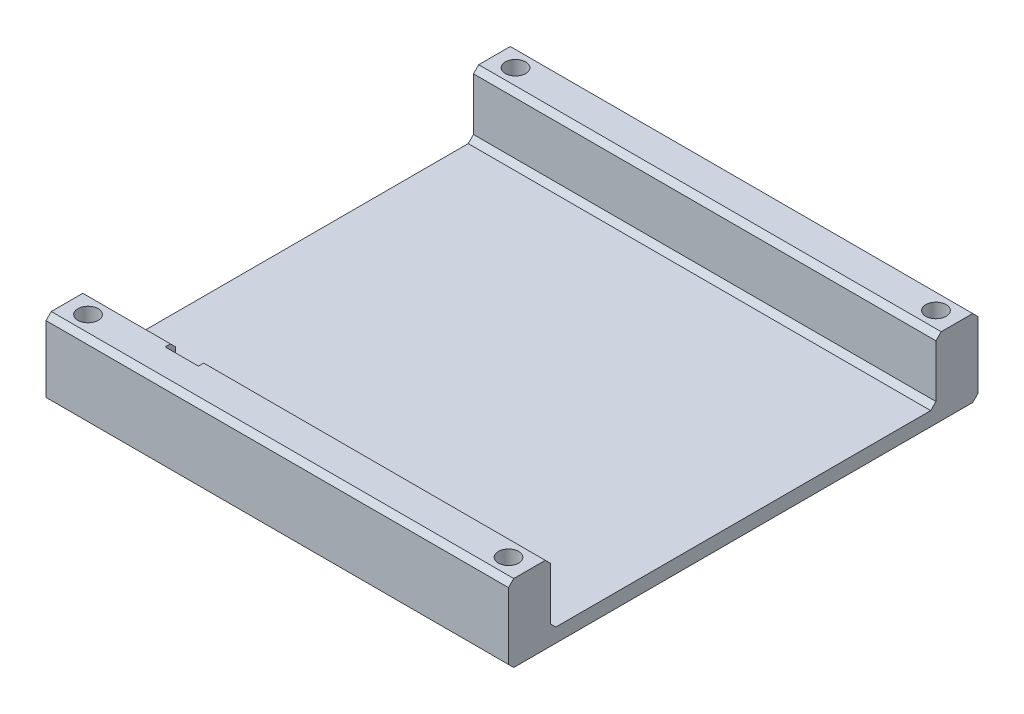
ISO-10303-21;
HEADER;
FILE_DESCRIPTION(('STEP AP214'),'2;1');
FILE_NAME('part.step','',(''),(''),'','','');
FILE_SCHEMA(('AUTOMOTIVE_DESIGN { 1 0 10303 214 1 1 1 1 }'));
ENDSEC;
DATA;
#1=APPLICATION_CONTEXT('core data for automotive mechanical design processes');
#2=APPLICATION_PROTOCOL_DEFINITION('international standard','automotive_design',2000,#1);
#3=PRODUCT_CONTEXT('',#1,'mechanical');
#4=PRODUCT('Part','Part','',(#3));
#5=PRODUCT_RELATED_PRODUCT_CATEGORY('part','',(#4));
#6=PRODUCT_DEFINITION_FORMATION('','',#4);
#7=PRODUCT_DEFINITION_CONTEXT('part definition',#1,'design');
#8=PRODUCT_DEFINITION('design','',#6,#7);
#9=PRODUCT_DEFINITION_SHAPE('','',#8);
#10=(LENGTH_UNIT() NAMED_UNIT(*) SI_UNIT(.MILLI.,.METRE.));
#11=(NAMED_UNIT(*) PLANE_ANGLE_UNIT() SI_UNIT($,.RADIAN.));
#12=(NAMED_UNIT(*) SI_UNIT($,.STERADIAN.) SOLID_ANGLE_UNIT());
#13=UNCERTAINTY_MEASURE_WITH_UNIT(LENGTH_MEASURE(1.E-05),#10,'distance_accuracy_value','');
#14=(GEOMETRIC_REPRESENTATION_CONTEXT(3) GLOBAL_UNCERTAINTY_ASSIGNED_CONTEXT((#13)) GLOBAL_UNIT_ASSIGNED_CONTEXT((#10,
#11,#12)) REPRESENTATION_CONTEXT('',''));
#15=CARTESIAN_POINT('',(0.,0.,0.));
#16=DIRECTION('',(0.,0.,1.));
#17=DIRECTION('',(1.,0.,0.));
#18=AXIS2_PLACEMENT_3D('',#15,#16,#17);
#19=CARTESIAN_POINT('',(0.,2.,0.));
#20=DIRECTION('',(0.,-1.,0.));
#21=DIRECTION('',(0.,0.,-1.));
#22=AXIS2_PLACEMENT_3D('',#19,#20,#21);
#23=PLANE('',#22);
#24=DIRECTION('',(0.,0.,1.));
#25=VECTOR('',#24,1.);
#26=CARTESIAN_POINT('',(17.257397728864,2.,-6.));
#27=LINE('',#26,#25);
#28=CARTESIAN_POINT('',(17.2573977288641,2.,-6.75));
#29=VERTEX_POINT('',#28);
#30=CARTESIAN_POINT('',(17.257397728864,2.,-4.5));
#31=VERTEX_POINT('',#30);
#32=EDGE_CURVE('E227',#29,#31,#27,.T.);
#33=ORIENTED_EDGE('',*,*,#32,.F.);
#34=DIRECTION('',(1.,0.,0.));
#35=VECTOR('',#34,1.);
#36=CARTESIAN_POINT('',(66.,2.,-6.75));
#37=LINE('',#36,#35);
#38=CARTESIAN_POINT('',(66.,2.,-6.75));
#39=VERTEX_POINT('',#38);
#40=EDGE_CURVE('E347',#29,#39,#37,.T.);
#41=ORIENTED_EDGE('',*,*,#40,.T.);
#42=DIRECTION('',(0.,0.,-1.));
#43=VECTOR('',#42,1.);
#44=CARTESIAN_POINT('',(66.,2.,0.));
#45=LINE('',#44,#43);
#46=CARTESIAN_POINT('',(66.,2.,-60.25));
#47=VERTEX_POINT('',#46);
#48=EDGE_CURVE('E250',#39,#47,#45,.T.);
#49=ORIENTED_EDGE('',*,*,#48,.T.);
#50=DIRECTION('',(-1.,0.,0.));
#51=VECTOR('',#50,1.);
#52=CARTESIAN_POINT('',(0.,2.,-60.25));
#53=LINE('',#52,#51);
#54=CARTESIAN_POINT('',(0.,2.,-60.25));
#55=VERTEX_POINT('',#54);
#56=EDGE_CURVE('E337',#47,#55,#53,.T.);
#57=ORIENTED_EDGE('',*,*,#56,.T.);
#58=DIRECTION('',(0.,0.,1.));
#59=VECTOR('',#58,1.);
#60=CARTESIAN_POINT('',(0.,2.,0.));
#61=LINE('',#60,#59);
#62=CARTESIAN_POINT('',(0.,2.,-6.75));
#63=VERTEX_POINT('',#62);
#64=EDGE_CURVE('E241',#55,#63,#61,.T.);
#65=ORIENTED_EDGE('',*,*,#64,.T.);
#66=DIRECTION('',(1.,0.,0.));
#67=VECTOR('',#66,1.);
#68=CARTESIAN_POINT('',(12.5,2.,-6.75));
#69=LINE('',#68,#67);
#70=CARTESIAN_POINT('',(12.5,2.,-6.75));
#71=VERTEX_POINT('',#70);
#72=EDGE_CURVE('E345',#63,#71,#69,.T.);
#73=ORIENTED_EDGE('',*,*,#72,.T.);
#74=DIRECTION('',(0.,0.,-1.));
#75=VECTOR('',#74,1.);
#76=CARTESIAN_POINT('',(12.5,2.,-6.));
#77=LINE('',#76,#75);
#78=CARTESIAN_POINT('',(12.5,2.,-4.5));
#79=VERTEX_POINT('',#78);
#80=EDGE_CURVE('E245',#79,#71,#77,.T.);
#81=ORIENTED_EDGE('',*,*,#80,.F.);
#82=DIRECTION('',(-1.,0.,0.));
#83=VECTOR('',#82,1.);
#84=CARTESIAN_POINT('',(12.5,2.,-4.5));
#85=LINE('',#84,#83);
#86=EDGE_CURVE('E216',#31,#79,#85,.T.);
#87=ORIENTED_EDGE('',*,*,#86,.F.);
#88=EDGE_LOOP('',(#33,#41,#49,#57,#65,#73,#81,#87));
#89=FACE_BOUND('',#88,.T.);
#90=ADVANCED_FACE('F50',(#89),#23,.F.);
#91=CARTESIAN_POINT('',(0.,2.,0.));
#92=DIRECTION('',(1.,0.,0.));
#93=DIRECTION('',(0.,0.,-1.));
#94=AXIS2_PLACEMENT_3D('',#91,#92,#93);
#95=PLANE('',#94);
#96=DIRECTION('',(0.,-1.,0.));
#97=VECTOR('',#96,1.);
#98=CARTESIAN_POINT('',(0.,2.,-67.));
#99=LINE('',#98,#97);
#100=CARTESIAN_POINT('',(0.,10.25,-67.));
#101=VERTEX_POINT('',#100);
#102=CARTESIAN_POINT('',(0.,0.750000000000001,-67.));
#103=VERTEX_POINT('',#102);
#104=EDGE_CURVE('E252',#101,#103,#99,.T.);
#105=ORIENTED_EDGE('',*,*,#104,.T.);
#106=DIRECTION('',(0.,-0.707106781186548,0.707106781186548));
#107=VECTOR('',#106,1.);
#108=CARTESIAN_POINT('',(0.,0.750000000000001,-67.));
#109=LINE('',#108,#107);
#110=CARTESIAN_POINT('',(0.,0.,-66.25));
#111=VERTEX_POINT('',#110);
#112=EDGE_CURVE('E296',#103,#111,#109,.T.);
#113=ORIENTED_EDGE('',*,*,#112,.T.);
#114=DIRECTION('',(0.,0.,1.));
#115=VECTOR('',#114,1.);
#116=CARTESIAN_POINT('',(0.,0.,0.));
#117=LINE('',#116,#115);
#118=CARTESIAN_POINT('',(0.,0.,-0.750000000000001));
#119=VERTEX_POINT('',#118);
#120=EDGE_CURVE('E251',#111,#119,#117,.T.);
#121=ORIENTED_EDGE('',*,*,#120,.T.);
#122=DIRECTION('',(0.,0.707106781186548,0.707106781186548));
#123=VECTOR('',#122,1.);
#124=CARTESIAN_POINT('',(0.,0.750000000000001,0.));
#125=LINE('',#124,#123);
#126=CARTESIAN_POINT('',(0.,0.750000000000001,0.));
#127=VERTEX_POINT('',#126);
#128=EDGE_CURVE('E293',#119,#127,#125,.T.);
#129=ORIENTED_EDGE('',*,*,#128,.T.);
#130=DIRECTION('',(0.,-1.,0.));
#131=VECTOR('',#130,1.);
#132=CARTESIAN_POINT('',(0.,2.,0.));
#133=LINE('',#132,#131);
#134=CARTESIAN_POINT('',(0.,10.25,0.));
#135=VERTEX_POINT('',#134);
#136=EDGE_CURVE('E275',#135,#127,#133,.T.);
#137=ORIENTED_EDGE('',*,*,#136,.F.);
#138=DIRECTION('',(0.,-0.707106781186548,0.707106781186548));
#139=VECTOR('',#138,1.);
#140=CARTESIAN_POINT('',(0.,11.,-0.750000000000001));
#141=LINE('',#140,#139);
#142=CARTESIAN_POINT('',(0.,11.,-0.750000000000001));
#143=VERTEX_POINT('',#142);
#144=EDGE_CURVE('E289',#135,#143,#141,.F.);
#145=ORIENTED_EDGE('',*,*,#144,.T.);
#146=DIRECTION('',(0.,0.,1.));
#147=VECTOR('',#146,1.);
#148=CARTESIAN_POINT('',(0.,11.,0.));
#149=LINE('',#148,#147);
#150=CARTESIAN_POINT('',(0.,11.,-5.24999999999999));
#151=VERTEX_POINT('',#150);
#152=EDGE_CURVE('E236',#151,#143,#149,.T.);
#153=ORIENTED_EDGE('',*,*,#152,.F.);
#154=DIRECTION('',(0.,0.707106781186548,0.707106781186548));
#155=VECTOR('',#154,1.);
#156=CARTESIAN_POINT('',(0.,11.,-5.24999999999999));
#157=LINE('',#156,#155);
#158=CARTESIAN_POINT('',(0.,10.25,-6.));
#159=VERTEX_POINT('',#158);
#160=EDGE_CURVE('E295',#151,#159,#157,.F.);
#161=ORIENTED_EDGE('',*,*,#160,.T.);
#162=DIRECTION('',(0.,-1.,0.));
#163=VECTOR('',#162,1.);
#164=CARTESIAN_POINT('',(0.,11.,-6.));
#165=LINE('',#164,#163);
#166=CARTESIAN_POINT('',(0.,2.75,-6.));
#167=VERTEX_POINT('',#166);
#168=EDGE_CURVE('E224',#159,#167,#165,.T.);
#169=ORIENTED_EDGE('',*,*,#168,.T.);
#170=DIRECTION('',(0.,0.707106781186548,0.707106781186548));
#171=VECTOR('',#170,1.);
#172=CARTESIAN_POINT('',(0.,5.375,-3.375));
#173=LINE('',#172,#171);
#174=EDGE_CURVE('E395',#167,#63,#173,.F.);
#175=ORIENTED_EDGE('',*,*,#174,.T.);
#176=ORIENTED_EDGE('',*,*,#64,.F.);
#177=DIRECTION('',(0.,-0.707106781186548,0.707106781186548));
#178=VECTOR('',#177,1.);
#179=CARTESIAN_POINT('',(0.,-28.125,-30.125));
#180=LINE('',#179,#178);
#181=CARTESIAN_POINT('',(0.,2.75,-61.));
#182=VERTEX_POINT('',#181);
#183=EDGE_CURVE('E11',#55,#182,#180,.F.);
#184=ORIENTED_EDGE('',*,*,#183,.T.);
#185=DIRECTION('',(0.,-1.,0.));
#186=VECTOR('',#185,1.);
#187=CARTESIAN_POINT('',(0.,11.,-61.));
#188=LINE('',#187,#186);
#189=CARTESIAN_POINT('',(0.,10.25,-61.));
#190=VERTEX_POINT('',#189);
#191=EDGE_CURVE('E260',#190,#182,#188,.T.);
#192=ORIENTED_EDGE('',*,*,#191,.F.);
#193=DIRECTION('',(0.,0.707106781186541,-0.707106781186554));
#194=VECTOR('',#193,1.);
#195=CARTESIAN_POINT('',(0.,11.,-61.75));
#196=LINE('',#195,#194);
#197=CARTESIAN_POINT('',(0.,11.,-61.75));
#198=VERTEX_POINT('',#197);
#199=EDGE_CURVE('E281',#190,#198,#196,.T.);
#200=ORIENTED_EDGE('',*,*,#199,.T.);
#201=DIRECTION('',(0.,0.,1.));
#202=VECTOR('',#201,1.);
#203=CARTESIAN_POINT('',(0.,11.,-67.));
#204=LINE('',#203,#202);
#205=CARTESIAN_POINT('',(0.,11.,-66.25));
#206=VERTEX_POINT('',#205);
#207=EDGE_CURVE('E443',#206,#198,#204,.T.);
#208=ORIENTED_EDGE('',*,*,#207,.F.);
#209=DIRECTION('',(0.,-0.707106781186541,-0.707106781186554));
#210=VECTOR('',#209,1.);
#211=CARTESIAN_POINT('',(0.,11.,-66.25));
#212=LINE('',#211,#210);
#213=EDGE_CURVE('E288',#206,#101,#212,.T.);
#214=ORIENTED_EDGE('',*,*,#213,.T.);
#215=EDGE_LOOP('',(#105,#113,#121,#129,#137,#145,#153,#161,#169,#175,#176,#184,#192,#200,#208,#214));
#216=FACE_BOUND('',#215,.T.);
#217=ADVANCED_FACE('F412',(#216),#95,.F.);
#218=CARTESIAN_POINT('',(0.,2.,0.));
#219=DIRECTION('',(0.,0.,-1.));
#220=DIRECTION('',(-1.,0.,0.));
#221=AXIS2_PLACEMENT_3D('',#218,#219,#220);
#222=PLANE('',#221);
#223=ORIENTED_EDGE('',*,*,#136,.T.);
#224=DIRECTION('',(1.,0.,0.));
#225=VECTOR('',#224,1.);
#226=CARTESIAN_POINT('',(66.,0.750000000000001,0.));
#227=LINE('',#226,#225);
#228=CARTESIAN_POINT('',(66.,0.750000000000001,0.));
#229=VERTEX_POINT('',#228);
#230=EDGE_CURVE('E327',#127,#229,#227,.T.);
#231=ORIENTED_EDGE('',*,*,#230,.T.);
#232=DIRECTION('',(0.,-1.,0.));
#233=VECTOR('',#232,1.);
#234=CARTESIAN_POINT('',(66.,2.,0.));
#235=LINE('',#234,#233);
#236=CARTESIAN_POINT('',(66.,10.25,0.));
#237=VERTEX_POINT('',#236);
#238=EDGE_CURVE('E268',#237,#229,#235,.T.);
#239=ORIENTED_EDGE('',*,*,#238,.F.);
#240=DIRECTION('',(-1.,0.,0.));
#241=VECTOR('',#240,1.);
#242=CARTESIAN_POINT('',(0.,10.25,0.));
#243=LINE('',#242,#241);
#244=EDGE_CURVE('E324',#237,#135,#243,.T.);
#245=ORIENTED_EDGE('',*,*,#244,.T.);
#246=EDGE_LOOP('',(#223,#231,#239,#245));
#247=FACE_BOUND('',#246,.T.);
#248=ADVANCED_FACE('F569',(#247),#222,.F.);
#249=CARTESIAN_POINT('',(66.,2.,0.));
#250=DIRECTION('',(-1.,0.,0.));
#251=DIRECTION('',(0.,0.,1.));
#252=AXIS2_PLACEMENT_3D('',#249,#250,#251);
#253=PLANE('',#252);
#254=DIRECTION('',(0.,0.,-1.));
#255=VECTOR('',#254,1.);
#256=CARTESIAN_POINT('',(66.,0.,0.));
#257=LINE('',#256,#255);
#258=CARTESIAN_POINT('',(66.,0.,-0.750000000000001));
#259=VERTEX_POINT('',#258);
#260=CARTESIAN_POINT('',(66.,0.,-66.25));
#261=VERTEX_POINT('',#260);
#262=EDGE_CURVE('E246',#259,#261,#257,.T.);
#263=ORIENTED_EDGE('',*,*,#262,.T.);
#264=DIRECTION('',(0.,0.707106781186548,-0.707106781186548));
#265=VECTOR('',#264,1.);
#266=CARTESIAN_POINT('',(66.,0.750000000000001,-67.));
#267=LINE('',#266,#265);
#268=CARTESIAN_POINT('',(66.,0.750000000000001,-67.));
#269=VERTEX_POINT('',#268);
#270=EDGE_CURVE('E325',#261,#269,#267,.T.);
#271=ORIENTED_EDGE('',*,*,#270,.T.);
#272=DIRECTION('',(0.,-1.,0.));
#273=VECTOR('',#272,1.);
#274=CARTESIAN_POINT('',(66.,2.,-67.));
#275=LINE('',#274,#273);
#276=CARTESIAN_POINT('',(66.,10.25,-67.));
#277=VERTEX_POINT('',#276);
#278=EDGE_CURVE('E262',#277,#269,#275,.T.);
#279=ORIENTED_EDGE('',*,*,#278,.F.);
#280=DIRECTION('',(0.,0.707106781186541,0.707106781186554));
#281=VECTOR('',#280,1.);
#282=CARTESIAN_POINT('',(66.,11.,-66.25));
#283=LINE('',#282,#281);
#284=CARTESIAN_POINT('',(66.,11.,-66.25));
#285=VERTEX_POINT('',#284);
#286=EDGE_CURVE('E309',#277,#285,#283,.T.);
#287=ORIENTED_EDGE('',*,*,#286,.T.);
#288=DIRECTION('',(0.,0.,-1.));
#289=VECTOR('',#288,1.);
#290=CARTESIAN_POINT('',(66.,11.,-67.));
#291=LINE('',#290,#289);
#292=CARTESIAN_POINT('',(66.,11.,-61.75));
#293=VERTEX_POINT('',#292);
#294=EDGE_CURVE('E421',#293,#285,#291,.T.);
#295=ORIENTED_EDGE('',*,*,#294,.F.);
#296=DIRECTION('',(0.,-0.707106781186541,0.707106781186554));
#297=VECTOR('',#296,1.);
#298=CARTESIAN_POINT('',(66.,11.,-61.75));
#299=LINE('',#298,#297);
#300=CARTESIAN_POINT('',(66.,10.25,-61.));
#301=VERTEX_POINT('',#300);
#302=EDGE_CURVE('E307',#293,#301,#299,.T.);
#303=ORIENTED_EDGE('',*,*,#302,.T.);
#304=DIRECTION('',(0.,-1.,0.));
#305=VECTOR('',#304,1.);
#306=CARTESIAN_POINT('',(66.,11.,-61.));
#307=LINE('',#306,#305);
#308=CARTESIAN_POINT('',(66.,2.75,-61.));
#309=VERTEX_POINT('',#308);
#310=EDGE_CURVE('E404',#301,#309,#307,.T.);
#311=ORIENTED_EDGE('',*,*,#310,.T.);
#312=DIRECTION('',(0.,0.707106781186548,-0.707106781186548));
#313=VECTOR('',#312,1.);
#314=CARTESIAN_POINT('',(66.,-28.125,-30.125));
#315=LINE('',#314,#313);
#316=EDGE_CURVE('E60',#309,#47,#315,.F.);
#317=ORIENTED_EDGE('',*,*,#316,.T.);
#318=ORIENTED_EDGE('',*,*,#48,.F.);
#319=DIRECTION('',(0.,-0.707106781186548,-0.707106781186548));
#320=VECTOR('',#319,1.);
#321=CARTESIAN_POINT('',(66.,5.375,-3.375));
#322=LINE('',#321,#320);
#323=CARTESIAN_POINT('',(66.,2.75,-6.));
#324=VERTEX_POINT('',#323);
#325=EDGE_CURVE('E386',#39,#324,#322,.F.);
#326=ORIENTED_EDGE('',*,*,#325,.T.);
#327=DIRECTION('',(0.,-1.,0.));
#328=VECTOR('',#327,1.);
#329=CARTESIAN_POINT('',(66.,11.,-6.));
#330=LINE('',#329,#328);
#331=CARTESIAN_POINT('',(66.,10.25,-6.));
#332=VERTEX_POINT('',#331);
#333=EDGE_CURVE('E430',#332,#324,#330,.T.);
#334=ORIENTED_EDGE('',*,*,#333,.F.);
#335=DIRECTION('',(0.,-0.707106781186548,-0.707106781186548));
#336=VECTOR('',#335,1.);
#337=CARTESIAN_POINT('',(66.,11.,-5.24999999999999));
#338=LINE('',#337,#336);
#339=CARTESIAN_POINT('',(66.,11.,-5.24999999999999));
#340=VERTEX_POINT('',#339);
#341=EDGE_CURVE('E311',#332,#340,#338,.F.);
#342=ORIENTED_EDGE('',*,*,#341,.T.);
#343=DIRECTION('',(0.,0.,-1.));
#344=VECTOR('',#343,1.);
#345=CARTESIAN_POINT('',(66.,11.,0.));
#346=LINE('',#345,#344);
#347=CARTESIAN_POINT('',(66.,11.,-0.750000000000001));
#348=VERTEX_POINT('',#347);
#349=EDGE_CURVE('E234',#348,#340,#346,.T.);
#350=ORIENTED_EDGE('',*,*,#349,.F.);
#351=DIRECTION('',(0.,0.707106781186548,-0.707106781186548));
#352=VECTOR('',#351,1.);
#353=CARTESIAN_POINT('',(66.,11.,-0.750000000000001));
#354=LINE('',#353,#352);
#355=EDGE_CURVE('E316',#348,#237,#354,.F.);
#356=ORIENTED_EDGE('',*,*,#355,.T.);
#357=ORIENTED_EDGE('',*,*,#238,.T.);
#358=DIRECTION('',(0.,-0.707106781186548,-0.707106781186548));
#359=VECTOR('',#358,1.);
#360=CARTESIAN_POINT('',(66.,0.750000000000001,0.));
#361=LINE('',#360,#359);
#362=EDGE_CURVE('E317',#229,#259,#361,.T.);
#363=ORIENTED_EDGE('',*,*,#362,.T.);
#364=EDGE_LOOP('',(#263,#271,#279,#287,#295,#303,#311,#317,#318,#326,#334,#342,#350,#356,#357,#363));
#365=FACE_BOUND('',#364,.T.);
#366=ADVANCED_FACE('F402',(#365),#253,.F.);
#367=CARTESIAN_POINT('',(0.,2.,-67.));
#368=DIRECTION('',(0.,0.,1.));
#369=DIRECTION('',(1.,0.,0.));
#370=AXIS2_PLACEMENT_3D('',#367,#368,#369);
#371=PLANE('',#370);
#372=ORIENTED_EDGE('',*,*,#278,.T.);
#373=DIRECTION('',(-1.,0.,0.));
#374=VECTOR('',#373,1.);
#375=CARTESIAN_POINT('',(0.,0.750000000000001,-67.));
#376=LINE('',#375,#374);
#377=EDGE_CURVE('E276',#269,#103,#376,.T.);
#378=ORIENTED_EDGE('',*,*,#377,.T.);
#379=ORIENTED_EDGE('',*,*,#104,.F.);
#380=DIRECTION('',(1.,0.,0.));
#381=VECTOR('',#380,1.);
#382=CARTESIAN_POINT('',(66.,10.25,-67.));
#383=LINE('',#382,#381);
#384=EDGE_CURVE('E277',#101,#277,#383,.T.);
#385=ORIENTED_EDGE('',*,*,#384,.T.);
#386=EDGE_LOOP('',(#372,#378,#379,#385));
#387=FACE_BOUND('',#386,.T.);
#388=ADVANCED_FACE('F549',(#387),#371,.F.);
#389=CARTESIAN_POINT('',(0.,0.,0.));
#390=DIRECTION('',(0.,-1.,0.));
#391=DIRECTION('',(0.,0.,-1.));
#392=AXIS2_PLACEMENT_3D('',#389,#390,#391);
#393=PLANE('',#392);
#394=ORIENTED_EDGE('',*,*,#120,.F.);
#395=DIRECTION('',(1.,0.,0.));
#396=VECTOR('',#395,1.);
#397=CARTESIAN_POINT('',(66.,0.,-66.25));
#398=LINE('',#397,#396);
#399=EDGE_CURVE('E304',#111,#261,#398,.T.);
#400=ORIENTED_EDGE('',*,*,#399,.T.);
#401=ORIENTED_EDGE('',*,*,#262,.F.);
#402=DIRECTION('',(-1.,0.,0.));
#403=VECTOR('',#402,1.);
#404=CARTESIAN_POINT('',(0.,0.,-0.750000000000001));
#405=LINE('',#404,#403);
#406=EDGE_CURVE('E303',#259,#119,#405,.T.);
#407=ORIENTED_EDGE('',*,*,#406,.T.);
#408=EDGE_LOOP('',(#394,#400,#401,#407));
#409=FACE_BOUND('',#408,.T.);
#410=ADVANCED_FACE('F559',(#409),#393,.T.);
#411=CARTESIAN_POINT('',(17.257397728864,11.,-6.));
#412=DIRECTION('',(0.,0.,1.));
#413=DIRECTION('',(1.,0.,0.));
#414=AXIS2_PLACEMENT_3D('',#411,#412,#413);
#415=PLANE('',#414);
#416=ORIENTED_EDGE('',*,*,#333,.T.);
#417=DIRECTION('',(-1.,0.,0.));
#418=VECTOR('',#417,1.);
#419=CARTESIAN_POINT('',(17.257397728864,2.75,-6.));
#420=LINE('',#419,#418);
#421=CARTESIAN_POINT('',(17.257397728864,2.75,-6.));
#422=VERTEX_POINT('',#421);
#423=EDGE_CURVE('E333',#324,#422,#420,.T.);
#424=ORIENTED_EDGE('',*,*,#423,.T.);
#425=DIRECTION('',(0.,-1.,0.));
#426=VECTOR('',#425,1.);
#427=CARTESIAN_POINT('',(17.257397728864,11.,-6.));
#428=LINE('',#427,#426);
#429=CARTESIAN_POINT('',(17.257397728864,10.25,-6.));
#430=VERTEX_POINT('',#429);
#431=EDGE_CURVE('E431',#430,#422,#428,.T.);
#432=ORIENTED_EDGE('',*,*,#431,.F.);
#433=DIRECTION('',(1.,0.,0.));
#434=VECTOR('',#433,1.);
#435=CARTESIAN_POINT('',(17.257397728864,10.25,-6.));
#436=LINE('',#435,#434);
#437=EDGE_CURVE('E335',#430,#332,#436,.T.);
#438=ORIENTED_EDGE('',*,*,#437,.T.);
#439=EDGE_LOOP('',(#416,#424,#432,#438));
#440=FACE_BOUND('',#439,.T.);
#441=ADVANCED_FACE('F596',(#440),#415,.F.);
#442=CARTESIAN_POINT('',(17.257397728864,11.,-6.));
#443=DIRECTION('',(1.,0.,0.));
#444=DIRECTION('',(0.,0.,-1.));
#445=AXIS2_PLACEMENT_3D('',#442,#443,#444);
#446=PLANE('',#445);
#447=DIRECTION('',(0.,0.,1.));
#448=VECTOR('',#447,1.);
#449=CARTESIAN_POINT('',(17.257397728864,11.,-6.));
#450=LINE('',#449,#448);
#451=CARTESIAN_POINT('',(17.257397728864,11.,-5.24999999999999));
#452=VERTEX_POINT('',#451);
#453=CARTESIAN_POINT('',(17.257397728864,11.,-4.5));
#454=VERTEX_POINT('',#453);
#455=EDGE_CURVE('E206',#452,#454,#450,.T.);
#456=ORIENTED_EDGE('',*,*,#455,.F.);
#457=DIRECTION('',(0.,0.707106781186548,0.707106781186548));
#458=VECTOR('',#457,1.);
#459=CARTESIAN_POINT('',(17.257397728864,11.,-5.24999999999997));
#460=LINE('',#459,#458);
#461=EDGE_CURVE('E75',#452,#430,#460,.F.);
#462=ORIENTED_EDGE('',*,*,#461,.T.);
#463=ORIENTED_EDGE('',*,*,#431,.T.);
#464=DIRECTION('',(0.,0.707106781186548,0.707106781186548));
#465=VECTOR('',#464,1.);
#466=CARTESIAN_POINT('',(17.257397728864,6.875,-1.875));
#467=LINE('',#466,#465);
#468=EDGE_CURVE('E384',#422,#29,#467,.F.);
#469=ORIENTED_EDGE('',*,*,#468,.T.);
#470=ORIENTED_EDGE('',*,*,#32,.T.);
#471=DIRECTION('',(0.,-1.,0.));
#472=VECTOR('',#471,1.);
#473=CARTESIAN_POINT('',(17.257397728864,11.,-4.5));
#474=LINE('',#473,#472);
#475=EDGE_CURVE('E218',#454,#31,#474,.T.);
#476=ORIENTED_EDGE('',*,*,#475,.F.);
#477=EDGE_LOOP('',(#456,#462,#463,#469,#470,#476));
#478=FACE_BOUND('',#477,.T.);
#479=ADVANCED_FACE('F586',(#478),#446,.F.);
#480=CARTESIAN_POINT('',(12.5,11.,-4.5));
#481=DIRECTION('',(0.,0.,1.));
#482=DIRECTION('',(1.,0.,0.));
#483=AXIS2_PLACEMENT_3D('',#480,#481,#482);
#484=PLANE('',#483);
#485=ORIENTED_EDGE('',*,*,#86,.T.);
#486=DIRECTION('',(0.,-1.,0.));
#487=VECTOR('',#486,1.);
#488=CARTESIAN_POINT('',(12.5,11.,-4.5));
#489=LINE('',#488,#487);
#490=CARTESIAN_POINT('',(12.5,11.,-4.5));
#491=VERTEX_POINT('',#490);
#492=EDGE_CURVE('E212',#491,#79,#489,.T.);
#493=ORIENTED_EDGE('',*,*,#492,.F.);
#494=DIRECTION('',(-1.,0.,0.));
#495=VECTOR('',#494,1.);
#496=CARTESIAN_POINT('',(12.5,11.,-4.5));
#497=LINE('',#496,#495);
#498=EDGE_CURVE('E200',#454,#491,#497,.T.);
#499=ORIENTED_EDGE('',*,*,#498,.F.);
#500=ORIENTED_EDGE('',*,*,#475,.T.);
#501=EDGE_LOOP('',(#485,#493,#499,#500));
#502=FACE_BOUND('',#501,.T.);
#503=ADVANCED_FACE('F214',(#502),#484,.F.);
#504=CARTESIAN_POINT('',(12.5,11.,-6.));
#505=DIRECTION('',(-1.,0.,0.));
#506=DIRECTION('',(0.,0.,1.));
#507=AXIS2_PLACEMENT_3D('',#504,#505,#506);
#508=PLANE('',#507);
#509=DIRECTION('',(0.,-1.,0.));
#510=VECTOR('',#509,1.);
#511=CARTESIAN_POINT('',(12.5,11.,-6.));
#512=LINE('',#511,#510);
#513=CARTESIAN_POINT('',(12.5,10.25,-6.));
#514=VERTEX_POINT('',#513);
#515=CARTESIAN_POINT('',(12.5,2.75,-6.));
#516=VERTEX_POINT('',#515);
#517=EDGE_CURVE('E217',#514,#516,#512,.T.);
#518=ORIENTED_EDGE('',*,*,#517,.F.);
#519=DIRECTION('',(0.,-0.707106781186548,-0.707106781186548));
#520=VECTOR('',#519,1.);
#521=CARTESIAN_POINT('',(12.5,11.,-5.24999999999999));
#522=LINE('',#521,#520);
#523=CARTESIAN_POINT('',(12.5,11.,-5.24999999999999));
#524=VERTEX_POINT('',#523);
#525=EDGE_CURVE('E62',#514,#524,#522,.F.);
#526=ORIENTED_EDGE('',*,*,#525,.T.);
#527=DIRECTION('',(0.,0.,-1.));
#528=VECTOR('',#527,1.);
#529=CARTESIAN_POINT('',(12.5,11.,-6.));
#530=LINE('',#529,#528);
#531=EDGE_CURVE('E201',#491,#524,#530,.T.);
#532=ORIENTED_EDGE('',*,*,#531,.F.);
#533=ORIENTED_EDGE('',*,*,#492,.T.);
#534=ORIENTED_EDGE('',*,*,#80,.T.);
#535=DIRECTION('',(0.,-0.707106781186548,-0.707106781186548));
#536=VECTOR('',#535,1.);
#537=CARTESIAN_POINT('',(12.5,6.875,-1.875));
#538=LINE('',#537,#536);
#539=EDGE_CURVE('E394',#71,#516,#538,.F.);
#540=ORIENTED_EDGE('',*,*,#539,.T.);
#541=EDGE_LOOP('',(#518,#526,#532,#533,#534,#540));
#542=FACE_BOUND('',#541,.T.);
#543=ADVANCED_FACE('F222',(#542),#508,.F.);
#544=CARTESIAN_POINT('',(0.,11.,-6.));
#545=DIRECTION('',(0.,0.,1.));
#546=DIRECTION('',(1.,0.,0.));
#547=AXIS2_PLACEMENT_3D('',#544,#545,#546);
#548=PLANE('',#547);
#549=ORIENTED_EDGE('',*,*,#517,.T.);
#550=DIRECTION('',(-1.,0.,0.));
#551=VECTOR('',#550,1.);
#552=CARTESIAN_POINT('',(0.,2.75,-6.));
#553=LINE('',#552,#551);
#554=EDGE_CURVE('E355',#516,#167,#553,.T.);
#555=ORIENTED_EDGE('',*,*,#554,.T.);
#556=ORIENTED_EDGE('',*,*,#168,.F.);
#557=DIRECTION('',(1.,0.,0.));
#558=VECTOR('',#557,1.);
#559=CARTESIAN_POINT('',(0.,10.25,-6.));
#560=LINE('',#559,#558);
#561=EDGE_CURVE('E349',#159,#514,#560,.T.);
#562=ORIENTED_EDGE('',*,*,#561,.T.);
#563=EDGE_LOOP('',(#549,#555,#556,#562));
#564=FACE_BOUND('',#563,.T.);
#565=ADVANCED_FACE('F582',(#564),#548,.F.);
#566=CARTESIAN_POINT('',(0.,11.,0.));
#567=DIRECTION('',(0.,-1.,0.));
#568=DIRECTION('',(0.,0.,-1.));
#569=AXIS2_PLACEMENT_3D('',#566,#567,#568);
#570=PLANE('',#569);
#571=CARTESIAN_POINT('',(3.,11.,-3.));
#572=DIRECTION('',(0.,1.,0.));
#573=DIRECTION('',(0.,0.,1.));
#574=AXIS2_PLACEMENT_3D('',#571,#572,#573);
#575=CIRCLE('',#574,1.45);
#576=CARTESIAN_POINT('',(3.,11.,-1.55));
#577=VERTEX_POINT('',#576);
#578=EDGE_CURVE('E466',#577,#577,#575,.T.);
#579=ORIENTED_EDGE('',*,*,#578,.F.);
#580=EDGE_LOOP('',(#579));
#581=FACE_BOUND('',#580,.T.);
#582=CARTESIAN_POINT('',(63.,11.,-3.));
#583=DIRECTION('',(0.,1.,0.));
#584=DIRECTION('',(0.,0.,1.));
#585=AXIS2_PLACEMENT_3D('',#582,#583,#584);
#586=CIRCLE('',#585,1.45);
#587=CARTESIAN_POINT('',(63.,11.,-1.55));
#588=VERTEX_POINT('',#587);
#589=EDGE_CURVE('E480',#588,#588,#586,.T.);
#590=ORIENTED_EDGE('',*,*,#589,.F.);
#591=EDGE_LOOP('',(#590));
#592=FACE_BOUND('',#591,.T.);
#593=ORIENTED_EDGE('',*,*,#531,.T.);
#594=DIRECTION('',(-1.,0.,0.));
#595=VECTOR('',#594,1.);
#596=CARTESIAN_POINT('',(0.,11.,-5.24999999999999));
#597=LINE('',#596,#595);
#598=EDGE_CURVE('E361',#524,#151,#597,.T.);
#599=ORIENTED_EDGE('',*,*,#598,.T.);
#600=ORIENTED_EDGE('',*,*,#152,.T.);
#601=DIRECTION('',(1.,0.,0.));
#602=VECTOR('',#601,1.);
#603=CARTESIAN_POINT('',(0.,11.,-0.750000000000001));
#604=LINE('',#603,#602);
#605=EDGE_CURVE('E359',#143,#348,#604,.T.);
#606=ORIENTED_EDGE('',*,*,#605,.T.);
#607=ORIENTED_EDGE('',*,*,#349,.T.);
#608=DIRECTION('',(-1.,0.,0.));
#609=VECTOR('',#608,1.);
#610=CARTESIAN_POINT('',(0.,11.,-5.24999999999999));
#611=LINE('',#610,#609);
#612=EDGE_CURVE('E358',#340,#452,#611,.T.);
#613=ORIENTED_EDGE('',*,*,#612,.T.);
#614=ORIENTED_EDGE('',*,*,#455,.T.);
#615=ORIENTED_EDGE('',*,*,#498,.T.);
#616=EDGE_LOOP('',(#593,#599,#600,#606,#607,#613,#614,#615));
#617=FACE_BOUND('',#616,.T.);
#618=ADVANCED_FACE('F203',(#581,#592,#617),#570,.F.);
#619=CARTESIAN_POINT('',(0.,11.,-61.));
#620=DIRECTION('',(0.,0.,-1.));
#621=DIRECTION('',(-1.,0.,0.));
#622=AXIS2_PLACEMENT_3D('',#619,#620,#621);
#623=PLANE('',#622);
#624=ORIENTED_EDGE('',*,*,#310,.F.);
#625=DIRECTION('',(-1.,0.,0.));
#626=VECTOR('',#625,1.);
#627=CARTESIAN_POINT('',(0.,10.25,-61.));
#628=LINE('',#627,#626);
#629=EDGE_CURVE('E385',#301,#190,#628,.T.);
#630=ORIENTED_EDGE('',*,*,#629,.T.);
#631=ORIENTED_EDGE('',*,*,#191,.T.);
#632=DIRECTION('',(1.,0.,0.));
#633=VECTOR('',#632,1.);
#634=CARTESIAN_POINT('',(66.,2.75,-61.));
#635=LINE('',#634,#633);
#636=EDGE_CURVE('E378',#182,#309,#635,.T.);
#637=ORIENTED_EDGE('',*,*,#636,.T.);
#638=EDGE_LOOP('',(#624,#630,#631,#637));
#639=FACE_BOUND('',#638,.T.);
#640=ADVANCED_FACE('F416',(#639),#623,.F.);
#641=CARTESIAN_POINT('',(0.,11.,0.));
#642=DIRECTION('',(0.,1.,0.));
#643=DIRECTION('',(0.,0.,1.));
#644=AXIS2_PLACEMENT_3D('',#641,#642,#643);
#645=PLANE('',#644);
#646=CARTESIAN_POINT('',(63.,11.,-64.));
#647=DIRECTION('',(0.,1.,0.));
#648=DIRECTION('',(0.,0.,1.));
#649=AXIS2_PLACEMENT_3D('',#646,#647,#648);
#650=CIRCLE('',#649,1.45);
#651=CARTESIAN_POINT('',(63.,11.,-62.55));
#652=VERTEX_POINT('',#651);
#653=EDGE_CURVE('E458',#652,#652,#650,.T.);
#654=ORIENTED_EDGE('',*,*,#653,.F.);
#655=EDGE_LOOP('',(#654));
#656=FACE_BOUND('',#655,.T.);
#657=CARTESIAN_POINT('',(3.,11.,-64.));
#658=DIRECTION('',(0.,1.,0.));
#659=DIRECTION('',(0.,0.,1.));
#660=AXIS2_PLACEMENT_3D('',#657,#658,#659);
#661=CIRCLE('',#660,1.45);
#662=CARTESIAN_POINT('',(3.,11.,-62.55));
#663=VERTEX_POINT('',#662);
#664=EDGE_CURVE('E457',#663,#663,#661,.T.);
#665=ORIENTED_EDGE('',*,*,#664,.F.);
#666=EDGE_LOOP('',(#665));
#667=FACE_BOUND('',#666,.T.);
#668=ORIENTED_EDGE('',*,*,#294,.T.);
#669=DIRECTION('',(-1.,0.,0.));
#670=VECTOR('',#669,1.);
#671=CARTESIAN_POINT('',(0.,11.,-66.25));
#672=LINE('',#671,#670);
#673=EDGE_CURVE('E372',#285,#206,#672,.T.);
#674=ORIENTED_EDGE('',*,*,#673,.T.);
#675=ORIENTED_EDGE('',*,*,#207,.T.);
#676=DIRECTION('',(1.,0.,0.));
#677=VECTOR('',#676,1.);
#678=CARTESIAN_POINT('',(66.,11.,-61.75));
#679=LINE('',#678,#677);
#680=EDGE_CURVE('E367',#198,#293,#679,.T.);
#681=ORIENTED_EDGE('',*,*,#680,.T.);
#682=EDGE_LOOP('',(#668,#674,#675,#681));
#683=FACE_BOUND('',#682,.T.);
#684=ADVANCED_FACE('F536',(#656,#667,#683),#645,.T.);
#685=CARTESIAN_POINT('',(3.,8.,-64.));
#686=DIRECTION('',(0.,1.,0.));
#687=DIRECTION('',(0.,0.,1.));
#688=AXIS2_PLACEMENT_3D('',#685,#686,#687);
#689=CYLINDRICAL_SURFACE('',#688,1.45);
#690=CARTESIAN_POINT('',(3.,8.,-64.));
#691=DIRECTION('',(0.,1.,0.));
#692=DIRECTION('',(0.,0.,1.));
#693=AXIS2_PLACEMENT_3D('',#690,#691,#692);
#694=CIRCLE('',#693,1.45);
#695=CARTESIAN_POINT('',(3.,8.,-62.55));
#696=VERTEX_POINT('',#695);
#697=EDGE_CURVE('E435',#696,#696,#694,.T.);
#698=ORIENTED_EDGE('',*,*,#697,.F.);
#699=EDGE_LOOP('',(#698));
#700=FACE_BOUND('',#699,.T.);
#701=ORIENTED_EDGE('',*,*,#664,.T.);
#702=EDGE_LOOP('',(#701));
#703=FACE_BOUND('',#702,.T.);
#704=ADVANCED_FACE('F537',(#700,#703),#689,.F.);
#705=CARTESIAN_POINT('',(3.,8.,-64.));
#706=DIRECTION('',(0.,1.,0.));
#707=DIRECTION('',(0.,0.,1.));
#708=AXIS2_PLACEMENT_3D('',#705,#706,#707);
#709=PLANE('',#708);
#710=CARTESIAN_POINT('',(3.,8.,-64.));
#711=DIRECTION('',(0.,1.,0.));
#712=DIRECTION('',(0.,0.,1.));
#713=AXIS2_PLACEMENT_3D('',#710,#711,#712);
#714=CIRCLE('',#713,1.05);
#715=CARTESIAN_POINT('',(3.,8.,-62.95));
#716=VERTEX_POINT('',#715);
#717=EDGE_CURVE('E488',#716,#716,#714,.T.);
#718=ORIENTED_EDGE('',*,*,#717,.F.);
#719=EDGE_LOOP('',(#718));
#720=FACE_BOUND('',#719,.T.);
#721=ORIENTED_EDGE('',*,*,#697,.T.);
#722=EDGE_LOOP('',(#721));
#723=FACE_BOUND('',#722,.T.);
#724=ADVANCED_FACE('F535',(#720,#723),#709,.T.);
#725=CARTESIAN_POINT('',(63.,8.,-64.));
#726=DIRECTION('',(0.,1.,0.));
#727=DIRECTION('',(0.,0.,1.));
#728=AXIS2_PLACEMENT_3D('',#725,#726,#727);
#729=CYLINDRICAL_SURFACE('',#728,1.45);
#730=CARTESIAN_POINT('',(63.,8.,-64.));
#731=DIRECTION('',(0.,1.,0.));
#732=DIRECTION('',(0.,0.,1.));
#733=AXIS2_PLACEMENT_3D('',#730,#731,#732);
#734=CIRCLE('',#733,1.45);
#735=CARTESIAN_POINT('',(63.,8.,-62.55));
#736=VERTEX_POINT('',#735);
#737=EDGE_CURVE('E481',#736,#736,#734,.T.);
#738=ORIENTED_EDGE('',*,*,#737,.F.);
#739=EDGE_LOOP('',(#738));
#740=FACE_BOUND('',#739,.T.);
#741=ORIENTED_EDGE('',*,*,#653,.T.);
#742=EDGE_LOOP('',(#741));
#743=FACE_BOUND('',#742,.T.);
#744=ADVANCED_FACE('F528',(#740,#743),#729,.F.);
#745=CARTESIAN_POINT('',(63.,8.,-64.));
#746=DIRECTION('',(0.,1.,0.));
#747=DIRECTION('',(0.,0.,1.));
#748=AXIS2_PLACEMENT_3D('',#745,#746,#747);
#749=PLANE('',#748);
#750=CARTESIAN_POINT('',(63.,8.,-64.));
#751=DIRECTION('',(0.,1.,0.));
#752=DIRECTION('',(0.,0.,1.));
#753=AXIS2_PLACEMENT_3D('',#750,#751,#752);
#754=CIRCLE('',#753,1.04999999999999);
#755=CARTESIAN_POINT('',(63.,8.,-62.95));
#756=VERTEX_POINT('',#755);
#757=EDGE_CURVE('E495',#756,#756,#754,.T.);
#758=ORIENTED_EDGE('',*,*,#757,.F.);
#759=EDGE_LOOP('',(#758));
#760=FACE_BOUND('',#759,.T.);
#761=ORIENTED_EDGE('',*,*,#737,.T.);
#762=EDGE_LOOP('',(#761));
#763=FACE_BOUND('',#762,.T.);
#764=ADVANCED_FACE('F525',(#760,#763),#749,.T.);
#765=CARTESIAN_POINT('',(63.,8.,-3.));
#766=DIRECTION('',(0.,1.,0.));
#767=DIRECTION('',(0.,0.,1.));
#768=AXIS2_PLACEMENT_3D('',#765,#766,#767);
#769=CYLINDRICAL_SURFACE('',#768,1.45);
#770=CARTESIAN_POINT('',(63.,8.,-3.));
#771=DIRECTION('',(0.,1.,0.));
#772=DIRECTION('',(0.,0.,1.));
#773=AXIS2_PLACEMENT_3D('',#770,#771,#772);
#774=CIRCLE('',#773,1.45);
#775=CARTESIAN_POINT('',(63.,8.,-1.55));
#776=VERTEX_POINT('',#775);
#777=EDGE_CURVE('E471',#776,#776,#774,.T.);
#778=ORIENTED_EDGE('',*,*,#777,.F.);
#779=EDGE_LOOP('',(#778));
#780=FACE_BOUND('',#779,.T.);
#781=ORIENTED_EDGE('',*,*,#589,.T.);
#782=EDGE_LOOP('',(#781));
#783=FACE_BOUND('',#782,.T.);
#784=ADVANCED_FACE('F522',(#780,#783),#769,.F.);
#785=CARTESIAN_POINT('',(63.,8.,-3.));
#786=DIRECTION('',(0.,1.,0.));
#787=DIRECTION('',(0.,0.,1.));
#788=AXIS2_PLACEMENT_3D('',#785,#786,#787);
#789=PLANE('',#788);
#790=CARTESIAN_POINT('',(63.,8.,-3.));
#791=DIRECTION('',(0.,1.,0.));
#792=DIRECTION('',(0.,0.,1.));
#793=AXIS2_PLACEMENT_3D('',#790,#791,#792);
#794=CIRCLE('',#793,1.04999999999999);
#795=CARTESIAN_POINT('',(63.,8.,-1.95000000000001));
#796=VERTEX_POINT('',#795);
#797=EDGE_CURVE('E506',#796,#796,#794,.T.);
#798=ORIENTED_EDGE('',*,*,#797,.F.);
#799=EDGE_LOOP('',(#798));
#800=FACE_BOUND('',#799,.T.);
#801=ORIENTED_EDGE('',*,*,#777,.T.);
#802=EDGE_LOOP('',(#801));
#803=FACE_BOUND('',#802,.T.);
#804=ADVANCED_FACE('F819',(#800,#803),#789,.T.);
#805=CARTESIAN_POINT('',(3.,8.,-3.));
#806=DIRECTION('',(0.,1.,0.));
#807=DIRECTION('',(0.,0.,1.));
#808=AXIS2_PLACEMENT_3D('',#805,#806,#807);
#809=CYLINDRICAL_SURFACE('',#808,1.45);
#810=CARTESIAN_POINT('',(3.,8.,-3.));
#811=DIRECTION('',(0.,1.,0.));
#812=DIRECTION('',(0.,0.,1.));
#813=AXIS2_PLACEMENT_3D('',#810,#811,#812);
#814=CIRCLE('',#813,1.45);
#815=CARTESIAN_POINT('',(3.,8.,-1.55));
#816=VERTEX_POINT('',#815);
#817=EDGE_CURVE('E462',#816,#816,#814,.T.);
#818=ORIENTED_EDGE('',*,*,#817,.F.);
#819=EDGE_LOOP('',(#818));
#820=FACE_BOUND('',#819,.T.);
#821=ORIENTED_EDGE('',*,*,#578,.T.);
#822=EDGE_LOOP('',(#821));
#823=FACE_BOUND('',#822,.T.);
#824=ADVANCED_FACE('F809',(#820,#823),#809,.F.);
#825=CARTESIAN_POINT('',(3.,8.,-3.));
#826=DIRECTION('',(0.,1.,0.));
#827=DIRECTION('',(0.,0.,1.));
#828=AXIS2_PLACEMENT_3D('',#825,#826,#827);
#829=PLANE('',#828);
#830=CARTESIAN_POINT('',(3.,8.,-3.));
#831=DIRECTION('',(0.,1.,0.));
#832=DIRECTION('',(0.,0.,1.));
#833=AXIS2_PLACEMENT_3D('',#830,#831,#832);
#834=CIRCLE('',#833,1.05);
#835=CARTESIAN_POINT('',(3.,8.,-1.95));
#836=VERTEX_POINT('',#835);
#837=EDGE_CURVE('E498',#836,#836,#834,.T.);
#838=ORIENTED_EDGE('',*,*,#837,.F.);
#839=EDGE_LOOP('',(#838));
#840=FACE_BOUND('',#839,.T.);
#841=ORIENTED_EDGE('',*,*,#817,.T.);
#842=EDGE_LOOP('',(#841));
#843=FACE_BOUND('',#842,.T.);
#844=ADVANCED_FACE('F799',(#840,#843),#829,.T.);
#845=CARTESIAN_POINT('',(3.,5.,-3.));
#846=DIRECTION('',(0.,1.,0.));
#847=DIRECTION('',(0.,0.,1.));
#848=AXIS2_PLACEMENT_3D('',#845,#846,#847);
#849=CYLINDRICAL_SURFACE('',#848,1.05);
#850=CARTESIAN_POINT('',(3.,5.,-3.));
#851=DIRECTION('',(0.,1.,0.));
#852=DIRECTION('',(0.,0.,1.));
#853=AXIS2_PLACEMENT_3D('',#850,#851,#852);
#854=CIRCLE('',#853,1.05);
#855=CARTESIAN_POINT('',(3.,5.,-1.95));
#856=VERTEX_POINT('',#855);
#857=EDGE_CURVE('E497',#856,#856,#854,.T.);
#858=ORIENTED_EDGE('',*,*,#857,.F.);
#859=EDGE_LOOP('',(#858));
#860=FACE_BOUND('',#859,.T.);
#861=ORIENTED_EDGE('',*,*,#837,.T.);
#862=EDGE_LOOP('',(#861));
#863=FACE_BOUND('',#862,.T.);
#864=ADVANCED_FACE('F789',(#860,#863),#849,.F.);
#865=CARTESIAN_POINT('',(3.,5.,-3.));
#866=DIRECTION('',(0.,1.,0.));
#867=DIRECTION('',(0.,0.,1.));
#868=AXIS2_PLACEMENT_3D('',#865,#866,#867);
#869=PLANE('',#868);
#870=ORIENTED_EDGE('',*,*,#857,.T.);
#871=EDGE_LOOP('',(#870));
#872=FACE_BOUND('',#871,.T.);
#873=ADVANCED_FACE('F777',(#872),#869,.T.);
#874=CARTESIAN_POINT('',(63.,5.,-3.));
#875=DIRECTION('',(0.,1.,0.));
#876=DIRECTION('',(0.,0.,1.));
#877=AXIS2_PLACEMENT_3D('',#874,#875,#876);
#878=CYLINDRICAL_SURFACE('',#877,1.04999999999999);
#879=CARTESIAN_POINT('',(63.,5.,-3.));
#880=DIRECTION('',(0.,1.,0.));
#881=DIRECTION('',(0.,0.,1.));
#882=AXIS2_PLACEMENT_3D('',#879,#880,#881);
#883=CIRCLE('',#882,1.04999999999999);
#884=CARTESIAN_POINT('',(63.,5.,-1.95000000000001));
#885=VERTEX_POINT('',#884);
#886=EDGE_CURVE('E502',#885,#885,#883,.T.);
#887=ORIENTED_EDGE('',*,*,#886,.F.);
#888=EDGE_LOOP('',(#887));
#889=FACE_BOUND('',#888,.T.);
#890=ORIENTED_EDGE('',*,*,#797,.T.);
#891=EDGE_LOOP('',(#890));
#892=FACE_BOUND('',#891,.T.);
#893=ADVANCED_FACE('F768',(#889,#892),#878,.F.);
#894=CARTESIAN_POINT('',(63.,5.,-3.));
#895=DIRECTION('',(0.,1.,0.));
#896=DIRECTION('',(0.,0.,1.));
#897=AXIS2_PLACEMENT_3D('',#894,#895,#896);
#898=PLANE('',#897);
#899=ORIENTED_EDGE('',*,*,#886,.T.);
#900=EDGE_LOOP('',(#899));
#901=FACE_BOUND('',#900,.T.);
#902=ADVANCED_FACE('F757',(#901),#898,.T.);
#903=CARTESIAN_POINT('',(63.,5.,-64.));
#904=DIRECTION('',(0.,1.,0.));
#905=DIRECTION('',(0.,0.,1.));
#906=AXIS2_PLACEMENT_3D('',#903,#904,#905);
#907=CYLINDRICAL_SURFACE('',#906,1.04999999999999);
#908=CARTESIAN_POINT('',(63.,5.,-64.));
#909=DIRECTION('',(0.,1.,0.));
#910=DIRECTION('',(0.,0.,1.));
#911=AXIS2_PLACEMENT_3D('',#908,#909,#910);
#912=CIRCLE('',#911,1.04999999999999);
#913=CARTESIAN_POINT('',(63.,5.,-62.95));
#914=VERTEX_POINT('',#913);
#915=EDGE_CURVE('E515',#914,#914,#912,.T.);
#916=ORIENTED_EDGE('',*,*,#915,.F.);
#917=EDGE_LOOP('',(#916));
#918=FACE_BOUND('',#917,.T.);
#919=ORIENTED_EDGE('',*,*,#757,.T.);
#920=EDGE_LOOP('',(#919));
#921=FACE_BOUND('',#920,.T.);
#922=ADVANCED_FACE('F519',(#918,#921),#907,.F.);
#923=CARTESIAN_POINT('',(63.,5.,-64.));
#924=DIRECTION('',(0.,1.,0.));
#925=DIRECTION('',(0.,0.,1.));
#926=AXIS2_PLACEMENT_3D('',#923,#924,#925);
#927=PLANE('',#926);
#928=ORIENTED_EDGE('',*,*,#915,.T.);
#929=EDGE_LOOP('',(#928));
#930=FACE_BOUND('',#929,.T.);
#931=ADVANCED_FACE('F739',(#930),#927,.T.);
#932=CARTESIAN_POINT('',(3.,5.,-64.));
#933=DIRECTION('',(0.,1.,0.));
#934=DIRECTION('',(0.,0.,1.));
#935=AXIS2_PLACEMENT_3D('',#932,#933,#934);
#936=CYLINDRICAL_SURFACE('',#935,1.05);
#937=CARTESIAN_POINT('',(3.,5.,-64.));
#938=DIRECTION('',(0.,1.,0.));
#939=DIRECTION('',(0.,0.,1.));
#940=AXIS2_PLACEMENT_3D('',#937,#938,#939);
#941=CIRCLE('',#940,1.05);
#942=CARTESIAN_POINT('',(3.,5.,-62.95));
#943=VERTEX_POINT('',#942);
#944=EDGE_CURVE('E469',#943,#943,#941,.T.);
#945=ORIENTED_EDGE('',*,*,#944,.F.);
#946=EDGE_LOOP('',(#945));
#947=FACE_BOUND('',#946,.T.);
#948=ORIENTED_EDGE('',*,*,#717,.T.);
#949=EDGE_LOOP('',(#948));
#950=FACE_BOUND('',#949,.T.);
#951=ADVANCED_FACE('F727',(#947,#950),#936,.F.);
#952=CARTESIAN_POINT('',(3.,5.,-64.));
#953=DIRECTION('',(0.,1.,0.));
#954=DIRECTION('',(0.,0.,1.));
#955=AXIS2_PLACEMENT_3D('',#952,#953,#954);
#956=PLANE('',#955);
#957=ORIENTED_EDGE('',*,*,#944,.T.);
#958=EDGE_LOOP('',(#957));
#959=FACE_BOUND('',#958,.T.);
#960=ADVANCED_FACE('F635',(#959),#956,.T.);
#961=CARTESIAN_POINT('',(0.,0.750000000000001,-67.));
#962=DIRECTION('',(0.,-0.707106781186547,-0.707106781186547));
#963=DIRECTION('',(1.,0.,0.));
#964=AXIS2_PLACEMENT_3D('',#961,#962,#963);
#965=PLANE('',#964);
#966=ORIENTED_EDGE('',*,*,#270,.F.);
#967=ORIENTED_EDGE('',*,*,#399,.F.);
#968=ORIENTED_EDGE('',*,*,#112,.F.);
#969=ORIENTED_EDGE('',*,*,#377,.F.);
#970=EDGE_LOOP('',(#966,#967,#968,#969));
#971=FACE_BOUND('',#970,.T.);
#972=ADVANCED_FACE('F553',(#971),#965,.T.);
#973=CARTESIAN_POINT('',(0.,0.750000000000001,0.));
#974=DIRECTION('',(0.,-0.707106781186547,0.707106781186547));
#975=DIRECTION('',(-1.,0.,0.));
#976=AXIS2_PLACEMENT_3D('',#973,#974,#975);
#977=PLANE('',#976);
#978=ORIENTED_EDGE('',*,*,#128,.F.);
#979=ORIENTED_EDGE('',*,*,#406,.F.);
#980=ORIENTED_EDGE('',*,*,#362,.F.);
#981=ORIENTED_EDGE('',*,*,#230,.F.);
#982=EDGE_LOOP('',(#978,#979,#980,#981));
#983=FACE_BOUND('',#982,.T.);
#984=ADVANCED_FACE('F564',(#983),#977,.T.);
#985=CARTESIAN_POINT('',(17.257397728864,2.75,-6.));
#986=DIRECTION('',(0.,0.707106781186547,-0.707106781186547));
#987=DIRECTION('',(1.,0.,0.));
#988=AXIS2_PLACEMENT_3D('',#985,#986,#987);
#989=PLANE('',#988);
#990=ORIENTED_EDGE('',*,*,#325,.F.);
#991=ORIENTED_EDGE('',*,*,#40,.F.);
#992=ORIENTED_EDGE('',*,*,#468,.F.);
#993=ORIENTED_EDGE('',*,*,#423,.F.);
#994=EDGE_LOOP('',(#990,#991,#992,#993));
#995=FACE_BOUND('',#994,.T.);
#996=ADVANCED_FACE('F595',(#995),#989,.T.);
#997=CARTESIAN_POINT('',(0.,2.75,-6.));
#998=DIRECTION('',(0.,0.707106781186547,-0.707106781186547));
#999=DIRECTION('',(1.,0.,0.));
#1000=AXIS2_PLACEMENT_3D('',#997,#998,#999);
#1001=PLANE('',#1000);
#1002=ORIENTED_EDGE('',*,*,#539,.F.);
#1003=ORIENTED_EDGE('',*,*,#72,.F.);
#1004=ORIENTED_EDGE('',*,*,#174,.F.);
#1005=ORIENTED_EDGE('',*,*,#554,.F.);
#1006=EDGE_LOOP('',(#1002,#1003,#1004,#1005));
#1007=FACE_BOUND('',#1006,.T.);
#1008=ADVANCED_FACE('F588',(#1007),#1001,.T.);
#1009=CARTESIAN_POINT('',(0.,11.,-5.24999999999999));
#1010=DIRECTION('',(0.,-0.707106781186548,0.707106781186548));
#1011=DIRECTION('',(-1.,0.,0.));
#1012=AXIS2_PLACEMENT_3D('',#1009,#1010,#1011);
#1013=PLANE('',#1012);
#1014=ORIENTED_EDGE('',*,*,#525,.F.);
#1015=ORIENTED_EDGE('',*,*,#561,.F.);
#1016=ORIENTED_EDGE('',*,*,#160,.F.);
#1017=ORIENTED_EDGE('',*,*,#598,.F.);
#1018=EDGE_LOOP('',(#1014,#1015,#1016,#1017));
#1019=FACE_BOUND('',#1018,.T.);
#1020=ADVANCED_FACE('F576',(#1019),#1013,.F.);
#1021=CARTESIAN_POINT('',(0.,11.,-0.750000000000001));
#1022=DIRECTION('',(0.,-0.707106781186547,-0.707106781186547));
#1023=DIRECTION('',(1.,0.,0.));
#1024=AXIS2_PLACEMENT_3D('',#1021,#1022,#1023);
#1025=PLANE('',#1024);
#1026=ORIENTED_EDGE('',*,*,#144,.F.);
#1027=ORIENTED_EDGE('',*,*,#244,.F.);
#1028=ORIENTED_EDGE('',*,*,#355,.F.);
#1029=ORIENTED_EDGE('',*,*,#605,.F.);
#1030=EDGE_LOOP('',(#1026,#1027,#1028,#1029));
#1031=FACE_BOUND('',#1030,.T.);
#1032=ADVANCED_FACE('F571',(#1031),#1025,.F.);
#1033=CARTESIAN_POINT('',(0.,11.,-5.24999999999999));
#1034=DIRECTION('',(0.,-0.707106781186548,0.707106781186548));
#1035=DIRECTION('',(-1.,0.,0.));
#1036=AXIS2_PLACEMENT_3D('',#1033,#1034,#1035);
#1037=PLANE('',#1036);
#1038=ORIENTED_EDGE('',*,*,#341,.F.);
#1039=ORIENTED_EDGE('',*,*,#437,.F.);
#1040=ORIENTED_EDGE('',*,*,#461,.F.);
#1041=ORIENTED_EDGE('',*,*,#612,.F.);
#1042=EDGE_LOOP('',(#1038,#1039,#1040,#1041));
#1043=FACE_BOUND('',#1042,.T.);
#1044=ADVANCED_FACE('F600',(#1043),#1037,.F.);
#1045=CARTESIAN_POINT('',(0.,11.,-66.25));
#1046=DIRECTION('',(0.,0.707106781186554,-0.707106781186541));
#1047=DIRECTION('',(1.,0.,0.));
#1048=AXIS2_PLACEMENT_3D('',#1045,#1046,#1047);
#1049=PLANE('',#1048);
#1050=ORIENTED_EDGE('',*,*,#286,.F.);
#1051=ORIENTED_EDGE('',*,*,#384,.F.);
#1052=ORIENTED_EDGE('',*,*,#213,.F.);
#1053=ORIENTED_EDGE('',*,*,#673,.F.);
#1054=EDGE_LOOP('',(#1050,#1051,#1052,#1053));
#1055=FACE_BOUND('',#1054,.T.);
#1056=ADVANCED_FACE('F546',(#1055),#1049,.T.);
#1057=CARTESIAN_POINT('',(0.,11.,-61.75));
#1058=DIRECTION('',(0.,0.707106781186554,0.707106781186541));
#1059=DIRECTION('',(-1.,0.,0.));
#1060=AXIS2_PLACEMENT_3D('',#1057,#1058,#1059);
#1061=PLANE('',#1060);
#1062=ORIENTED_EDGE('',*,*,#199,.F.);
#1063=ORIENTED_EDGE('',*,*,#629,.F.);
#1064=ORIENTED_EDGE('',*,*,#302,.F.);
#1065=ORIENTED_EDGE('',*,*,#680,.F.);
#1066=EDGE_LOOP('',(#1062,#1063,#1064,#1065));
#1067=FACE_BOUND('',#1066,.T.);
#1068=ADVANCED_FACE('F603',(#1067),#1061,.T.);
#1069=CARTESIAN_POINT('',(0.,2.75,-61.));
#1070=DIRECTION('',(0.,0.707106781186547,0.707106781186547));
#1071=DIRECTION('',(-1.,0.,0.));
#1072=AXIS2_PLACEMENT_3D('',#1069,#1070,#1071);
#1073=PLANE('',#1072);
#1074=ORIENTED_EDGE('',*,*,#183,.F.);
#1075=ORIENTED_EDGE('',*,*,#56,.F.);
#1076=ORIENTED_EDGE('',*,*,#316,.F.);
#1077=ORIENTED_EDGE('',*,*,#636,.F.);
#1078=EDGE_LOOP('',(#1074,#1075,#1076,#1077));
#1079=FACE_BOUND('',#1078,.T.);
#1080=ADVANCED_FACE('F49',(#1079),#1073,.T.);
#1081=CLOSED_SHELL('',(#90,#217,#248,#366,#388,#410,#441,#479,#503,#543,#565,#618,#640,#684,
#704,#724,#744,#764,#784,#804,#824,#844,#864,#873,#893,#902,#922,#931,#951,#960,#972,#984,#996,
#1008,#1020,#1032,#1044,#1056,#1068,#1080));
#1082=MANIFOLD_SOLID_BREP('B2',#1081);
#1083=ADVANCED_BREP_SHAPE_REPRESENTATION('',(#18,#1082),#14);
#1084=SHAPE_DEFINITION_REPRESENTATION(#9,#1083);
ENDSEC;
END-ISO-10303-21;
